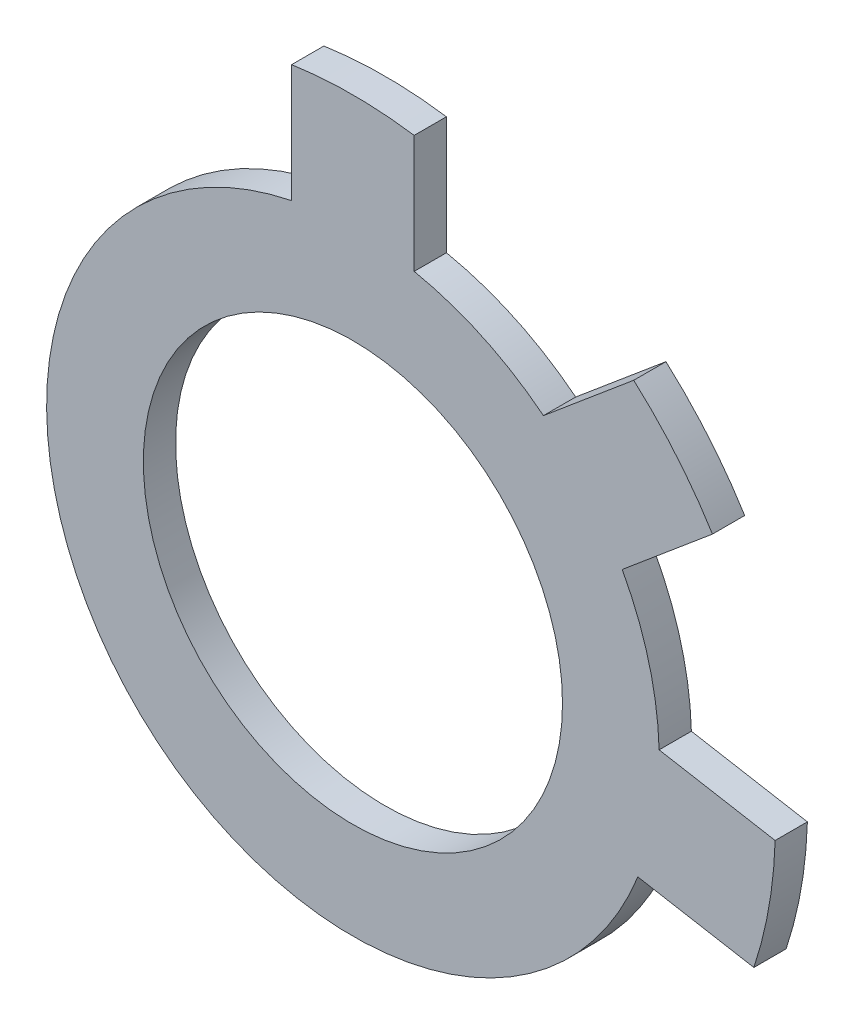
ISO-10303-21;
HEADER;
FILE_DESCRIPTION(('STEP AP214'),'2;1');
FILE_NAME('part.step','',(''),(''),'','','');
FILE_SCHEMA(('AUTOMOTIVE_DESIGN { 1 0 10303 214 1 1 1 1 }'));
ENDSEC;
DATA;
#1=APPLICATION_CONTEXT('core data for automotive mechanical design processes');
#2=APPLICATION_PROTOCOL_DEFINITION('international standard','automotive_design',2000,#1);
#3=PRODUCT_CONTEXT('',#1,'mechanical');
#4=PRODUCT('Part','Part','',(#3));
#5=PRODUCT_RELATED_PRODUCT_CATEGORY('part','',(#4));
#6=PRODUCT_DEFINITION_FORMATION('','',#4);
#7=PRODUCT_DEFINITION_CONTEXT('part definition',#1,'design');
#8=PRODUCT_DEFINITION('design','',#6,#7);
#9=PRODUCT_DEFINITION_SHAPE('','',#8);
#10=(LENGTH_UNIT() NAMED_UNIT(*) SI_UNIT(.MILLI.,.METRE.));
#11=(NAMED_UNIT(*) PLANE_ANGLE_UNIT() SI_UNIT($,.RADIAN.));
#12=(NAMED_UNIT(*) SI_UNIT($,.STERADIAN.) SOLID_ANGLE_UNIT());
#13=UNCERTAINTY_MEASURE_WITH_UNIT(LENGTH_MEASURE(1.E-05),#10,'distance_accuracy_value','');
#14=(GEOMETRIC_REPRESENTATION_CONTEXT(3) GLOBAL_UNCERTAINTY_ASSIGNED_CONTEXT((#13)) GLOBAL_UNIT_ASSIGNED_CONTEXT((#10,
#11,#12)) REPRESENTATION_CONTEXT('',''));
#15=CARTESIAN_POINT('',(0.,0.,0.));
#16=DIRECTION('',(0.,0.,1.));
#17=DIRECTION('',(1.,0.,0.));
#18=AXIS2_PLACEMENT_3D('',#15,#16,#17);
#19=CARTESIAN_POINT('',(0.,0.,1.));
#20=DIRECTION('',(0.,0.,1.));
#21=DIRECTION('',(1.,0.,0.));
#22=AXIS2_PLACEMENT_3D('',#19,#20,#21);
#23=PLANE('',#22);
#24=CARTESIAN_POINT('',(0.,0.,1.));
#25=DIRECTION('',(0.,0.,1.));
#26=DIRECTION('',(1.,0.,0.));
#27=AXIS2_PLACEMENT_3D('',#24,#25,#26);
#28=CIRCLE('',#27,13.1);
#29=CARTESIAN_POINT('',(1.9,12.9614813968157,1.));
#30=VERTEX_POINT('',#29);
#31=CARTESIAN_POINT('',(-1.9,12.9614813968157,1.));
#32=VERTEX_POINT('',#31);
#33=EDGE_CURVE('E176',#30,#32,#28,.T.);
#34=ORIENTED_EDGE('',*,*,#33,.T.);
#35=DIRECTION('',(0.,-1.,0.));
#36=VECTOR('',#35,1.);
#37=CARTESIAN_POINT('',(-1.9,9.30806102257608,1.));
#38=LINE('',#37,#36);
#39=CARTESIAN_POINT('',(-1.9,9.30806102257608,1.));
#40=VERTEX_POINT('',#39);
#41=EDGE_CURVE('E104',#32,#40,#38,.T.);
#42=ORIENTED_EDGE('',*,*,#41,.T.);
#43=CARTESIAN_POINT('',(0.,0.,1.));
#44=DIRECTION('',(0.,0.,1.));
#45=DIRECTION('',(1.,0.,0.));
#46=AXIS2_PLACEMENT_3D('',#43,#44,#45);
#47=CIRCLE('',#46,9.5);
#48=CARTESIAN_POINT('',(8.83671912297648,-3.48746256490615,1.));
#49=VERTEX_POINT('',#48);
#50=EDGE_CURVE('E203',#40,#49,#47,.T.);
#51=ORIENTED_EDGE('',*,*,#50,.T.);
#52=DIRECTION('',(0.984807753012207,-0.173648177666934,0.));
#53=VECTOR('',#52,1.);
#54=CARTESIAN_POINT('',(8.83671912297648,-3.48746256490615,1.));
#55=LINE('',#54,#53);
#56=CARTESIAN_POINT('',(12.4346358325404,-4.12187235514411,1.));
#57=VERTEX_POINT('',#56);
#58=EDGE_CURVE('E222',#49,#57,#55,.T.);
#59=ORIENTED_EDGE('',*,*,#58,.T.);
#60=CARTESIAN_POINT('',(0.,0.,1.));
#61=DIRECTION('',(0.,0.,1.));
#62=DIRECTION('',(1.,0.,0.));
#63=AXIS2_PLACEMENT_3D('',#60,#61,#62);
#64=CIRCLE('',#63,13.1);
#65=CARTESIAN_POINT('',(13.0944989076748,-0.37960289369773,1.));
#66=VERTEX_POINT('',#65);
#67=EDGE_CURVE('E219',#57,#66,#64,.T.);
#68=ORIENTED_EDGE('',*,*,#67,.T.);
#69=DIRECTION('',(-0.984807753012207,0.173648177666934,0.));
#70=VECTOR('',#69,1.);
#71=CARTESIAN_POINT('',(9.49658219811083,0.25480689654024,1.));
#72=LINE('',#71,#70);
#73=CARTESIAN_POINT('',(9.49658219811083,0.25480689654024,1.));
#74=VERTEX_POINT('',#73);
#75=EDGE_CURVE('E221',#66,#74,#72,.T.);
#76=ORIENTED_EDGE('',*,*,#75,.T.);
#77=CARTESIAN_POINT('',(0.,0.,1.));
#78=DIRECTION('',(0.,0.,1.));
#79=DIRECTION('',(1.,0.,0.));
#80=AXIS2_PLACEMENT_3D('',#77,#78,#79);
#81=CIRCLE('',#80,9.5);
#82=CARTESIAN_POINT('',(8.35168488096119,4.52762185359205,1.));
#83=VERTEX_POINT('',#82);
#84=EDGE_CURVE('E224',#74,#83,#81,.T.);
#85=ORIENTED_EDGE('',*,*,#84,.T.);
#86=DIRECTION('',(0.76604444311898,0.642787609686538,0.));
#87=VECTOR('',#86,1.);
#88=CARTESIAN_POINT('',(8.35168488096119,4.52762185359205,1.));
#89=LINE('',#88,#87);
#90=CARTESIAN_POINT('',(11.1503672570251,6.87599520312964,1.));
#91=VERTEX_POINT('',#90);
#92=EDGE_CURVE('E230',#83,#91,#89,.T.);
#93=ORIENTED_EDGE('',*,*,#92,.T.);
#94=CARTESIAN_POINT('',(0.,0.,1.));
#95=DIRECTION('',(0.,0.,1.));
#96=DIRECTION('',(1.,0.,0.));
#97=AXIS2_PLACEMENT_3D('',#94,#95,#96);
#98=CIRCLE('',#97,13.1);
#99=CARTESIAN_POINT('',(8.70777434021629,9.78696408698177,1.));
#100=VERTEX_POINT('',#99);
#101=EDGE_CURVE('E135',#91,#100,#98,.T.);
#102=ORIENTED_EDGE('',*,*,#101,.T.);
#103=DIRECTION('',(-0.76604444311898,-0.642787609686537,0.));
#104=VECTOR('',#103,1.);
#105=CARTESIAN_POINT('',(5.90909196415234,7.43859073744417,1.));
#106=LINE('',#105,#104);
#107=CARTESIAN_POINT('',(5.90909196415234,7.43859073744417,1.));
#108=VERTEX_POINT('',#107);
#109=EDGE_CURVE('E129',#100,#108,#106,.T.);
#110=ORIENTED_EDGE('',*,*,#109,.T.);
#111=CARTESIAN_POINT('',(0.,0.,1.));
#112=DIRECTION('',(0.,0.,1.));
#113=DIRECTION('',(1.,0.,0.));
#114=AXIS2_PLACEMENT_3D('',#111,#112,#113);
#115=CIRCLE('',#114,9.5);
#116=CARTESIAN_POINT('',(1.9,9.30806102257608,1.));
#117=VERTEX_POINT('',#116);
#118=EDGE_CURVE('E133',#108,#117,#115,.T.);
#119=ORIENTED_EDGE('',*,*,#118,.T.);
#120=DIRECTION('',(0.,1.,0.));
#121=VECTOR('',#120,1.);
#122=CARTESIAN_POINT('',(1.9,9.30806102257608,1.));
#123=LINE('',#122,#121);
#124=EDGE_CURVE('E49',#117,#30,#123,.T.);
#125=ORIENTED_EDGE('',*,*,#124,.T.);
#126=EDGE_LOOP('',(#34,#42,#51,#59,#68,#76,#85,#93,#102,#110,#119,#125));
#127=FACE_BOUND('',#126,.T.);
#128=CARTESIAN_POINT('',(0.,0.,1.));
#129=DIRECTION('',(0.,0.,1.));
#130=DIRECTION('',(1.,0.,0.));
#131=AXIS2_PLACEMENT_3D('',#128,#129,#130);
#132=CIRCLE('',#131,6.5);
#133=CARTESIAN_POINT('',(6.5,0.,1.));
#134=VERTEX_POINT('',#133);
#135=EDGE_CURVE('E157',#134,#134,#132,.T.);
#136=ORIENTED_EDGE('',*,*,#135,.F.);
#137=EDGE_LOOP('',(#136));
#138=FACE_BOUND('',#137,.T.);
#139=ADVANCED_FACE('F32',(#127,#138),#23,.T.);
#140=CARTESIAN_POINT('',(0.,0.,0.));
#141=DIRECTION('',(0.,0.,1.));
#142=DIRECTION('',(1.,0.,0.));
#143=AXIS2_PLACEMENT_3D('',#140,#141,#142);
#144=PLANE('',#143);
#145=CARTESIAN_POINT('',(0.,0.,0.));
#146=DIRECTION('',(0.,0.,1.));
#147=DIRECTION('',(1.,0.,0.));
#148=AXIS2_PLACEMENT_3D('',#145,#146,#147);
#149=CIRCLE('',#148,13.1);
#150=CARTESIAN_POINT('',(1.9,12.9614813968157,0.));
#151=VERTEX_POINT('',#150);
#152=CARTESIAN_POINT('',(-1.9,12.9614813968157,0.));
#153=VERTEX_POINT('',#152);
#154=EDGE_CURVE('E153',#151,#153,#149,.T.);
#155=ORIENTED_EDGE('',*,*,#154,.F.);
#156=DIRECTION('',(0.,1.,0.));
#157=VECTOR('',#156,1.);
#158=CARTESIAN_POINT('',(1.9,9.30806102257608,0.));
#159=LINE('',#158,#157);
#160=CARTESIAN_POINT('',(1.9,9.30806102257608,0.));
#161=VERTEX_POINT('',#160);
#162=EDGE_CURVE('E96',#161,#151,#159,.T.);
#163=ORIENTED_EDGE('',*,*,#162,.F.);
#164=CARTESIAN_POINT('',(0.,0.,0.));
#165=DIRECTION('',(0.,0.,1.));
#166=DIRECTION('',(1.,0.,0.));
#167=AXIS2_PLACEMENT_3D('',#164,#165,#166);
#168=CIRCLE('',#167,9.5);
#169=CARTESIAN_POINT('',(5.90909196415234,7.43859073744417,0.));
#170=VERTEX_POINT('',#169);
#171=EDGE_CURVE('E90',#170,#161,#168,.T.);
#172=ORIENTED_EDGE('',*,*,#171,.F.);
#173=DIRECTION('',(-0.76604444311898,-0.642787609686537,0.));
#174=VECTOR('',#173,1.);
#175=CARTESIAN_POINT('',(5.90909196415234,7.43859073744417,0.));
#176=LINE('',#175,#174);
#177=CARTESIAN_POINT('',(8.70777434021629,9.78696408698177,0.));
#178=VERTEX_POINT('',#177);
#179=EDGE_CURVE('E143',#178,#170,#176,.T.);
#180=ORIENTED_EDGE('',*,*,#179,.F.);
#181=CARTESIAN_POINT('',(0.,0.,0.));
#182=DIRECTION('',(0.,0.,1.));
#183=DIRECTION('',(1.,0.,0.));
#184=AXIS2_PLACEMENT_3D('',#181,#182,#183);
#185=CIRCLE('',#184,13.1);
#186=CARTESIAN_POINT('',(11.1503672570251,6.87599520312964,0.));
#187=VERTEX_POINT('',#186);
#188=EDGE_CURVE('E171',#187,#178,#185,.T.);
#189=ORIENTED_EDGE('',*,*,#188,.F.);
#190=DIRECTION('',(0.76604444311898,0.642787609686538,0.));
#191=VECTOR('',#190,1.);
#192=CARTESIAN_POINT('',(8.35168488096119,4.52762185359205,0.));
#193=LINE('',#192,#191);
#194=CARTESIAN_POINT('',(8.35168488096119,4.52762185359205,0.));
#195=VERTEX_POINT('',#194);
#196=EDGE_CURVE('E169',#195,#187,#193,.T.);
#197=ORIENTED_EDGE('',*,*,#196,.F.);
#198=CARTESIAN_POINT('',(0.,0.,0.));
#199=DIRECTION('',(0.,0.,1.));
#200=DIRECTION('',(1.,0.,0.));
#201=AXIS2_PLACEMENT_3D('',#198,#199,#200);
#202=CIRCLE('',#201,9.5);
#203=CARTESIAN_POINT('',(9.49658219811083,0.25480689654024,0.));
#204=VERTEX_POINT('',#203);
#205=EDGE_CURVE('E167',#204,#195,#202,.T.);
#206=ORIENTED_EDGE('',*,*,#205,.F.);
#207=DIRECTION('',(-0.984807753012207,0.173648177666934,0.));
#208=VECTOR('',#207,1.);
#209=CARTESIAN_POINT('',(9.49658219811083,0.25480689654024,0.));
#210=LINE('',#209,#208);
#211=CARTESIAN_POINT('',(13.0944989076748,-0.37960289369773,0.));
#212=VERTEX_POINT('',#211);
#213=EDGE_CURVE('E165',#212,#204,#210,.T.);
#214=ORIENTED_EDGE('',*,*,#213,.F.);
#215=CARTESIAN_POINT('',(0.,0.,0.));
#216=DIRECTION('',(0.,0.,1.));
#217=DIRECTION('',(1.,0.,0.));
#218=AXIS2_PLACEMENT_3D('',#215,#216,#217);
#219=CIRCLE('',#218,13.1);
#220=CARTESIAN_POINT('',(12.4346358325404,-4.12187235514411,0.));
#221=VERTEX_POINT('',#220);
#222=EDGE_CURVE('E163',#221,#212,#219,.T.);
#223=ORIENTED_EDGE('',*,*,#222,.F.);
#224=DIRECTION('',(0.984807753012207,-0.173648177666934,0.));
#225=VECTOR('',#224,1.);
#226=CARTESIAN_POINT('',(8.83671912297648,-3.48746256490615,0.));
#227=LINE('',#226,#225);
#228=CARTESIAN_POINT('',(8.83671912297648,-3.48746256490615,0.));
#229=VERTEX_POINT('',#228);
#230=EDGE_CURVE('E161',#229,#221,#227,.T.);
#231=ORIENTED_EDGE('',*,*,#230,.F.);
#232=CARTESIAN_POINT('',(0.,0.,0.));
#233=DIRECTION('',(0.,0.,1.));
#234=DIRECTION('',(1.,0.,0.));
#235=AXIS2_PLACEMENT_3D('',#232,#233,#234);
#236=CIRCLE('',#235,9.5);
#237=CARTESIAN_POINT('',(-1.9,9.30806102257608,0.));
#238=VERTEX_POINT('',#237);
#239=EDGE_CURVE('E159',#238,#229,#236,.T.);
#240=ORIENTED_EDGE('',*,*,#239,.F.);
#241=DIRECTION('',(0.,-1.,0.));
#242=VECTOR('',#241,1.);
#243=CARTESIAN_POINT('',(-1.9,9.30806102257608,0.));
#244=LINE('',#243,#242);
#245=EDGE_CURVE('E156',#153,#238,#244,.T.);
#246=ORIENTED_EDGE('',*,*,#245,.F.);
#247=EDGE_LOOP('',(#155,#163,#172,#180,#189,#197,#206,#214,#223,#231,#240,#246));
#248=FACE_BOUND('',#247,.T.);
#249=CARTESIAN_POINT('',(0.,0.,0.));
#250=DIRECTION('',(0.,0.,1.));
#251=DIRECTION('',(1.,0.,0.));
#252=AXIS2_PLACEMENT_3D('',#249,#250,#251);
#253=CIRCLE('',#252,6.5);
#254=CARTESIAN_POINT('',(6.5,0.,0.));
#255=VERTEX_POINT('',#254);
#256=EDGE_CURVE('E377',#255,#255,#253,.T.);
#257=ORIENTED_EDGE('',*,*,#256,.T.);
#258=EDGE_LOOP('',(#257));
#259=FACE_BOUND('',#258,.T.);
#260=ADVANCED_FACE('F207',(#248,#259),#144,.F.);
#261=CARTESIAN_POINT('',(0.,0.,1.));
#262=DIRECTION('',(0.,0.,-1.));
#263=DIRECTION('',(-1.,0.,0.));
#264=AXIS2_PLACEMENT_3D('',#261,#262,#263);
#265=CYLINDRICAL_SURFACE('',#264,13.1);
#266=ORIENTED_EDGE('',*,*,#154,.T.);
#267=DIRECTION('',(0.,0.,-1.));
#268=VECTOR('',#267,1.);
#269=CARTESIAN_POINT('',(-1.9,12.9614813968157,1.));
#270=LINE('',#269,#268);
#271=EDGE_CURVE('E11',#32,#153,#270,.T.);
#272=ORIENTED_EDGE('',*,*,#271,.F.);
#273=ORIENTED_EDGE('',*,*,#33,.F.);
#274=DIRECTION('',(0.,0.,-1.));
#275=VECTOR('',#274,1.);
#276=CARTESIAN_POINT('',(1.9,12.9614813968157,1.));
#277=LINE('',#276,#275);
#278=EDGE_CURVE('E149',#30,#151,#277,.T.);
#279=ORIENTED_EDGE('',*,*,#278,.T.);
#280=EDGE_LOOP('',(#266,#272,#273,#279));
#281=FACE_BOUND('',#280,.T.);
#282=ADVANCED_FACE('F34',(#281),#265,.T.);
#283=CARTESIAN_POINT('',(-1.9,9.30806102257608,1.));
#284=DIRECTION('',(1.,0.,0.));
#285=DIRECTION('',(0.,0.,-1.));
#286=AXIS2_PLACEMENT_3D('',#283,#284,#285);
#287=PLANE('',#286);
#288=ORIENTED_EDGE('',*,*,#245,.T.);
#289=DIRECTION('',(0.,0.,-1.));
#290=VECTOR('',#289,1.);
#291=CARTESIAN_POINT('',(-1.9,9.30806102257608,1.));
#292=LINE('',#291,#290);
#293=EDGE_CURVE('E41',#40,#238,#292,.T.);
#294=ORIENTED_EDGE('',*,*,#293,.F.);
#295=ORIENTED_EDGE('',*,*,#41,.F.);
#296=ORIENTED_EDGE('',*,*,#271,.T.);
#297=EDGE_LOOP('',(#288,#294,#295,#296));
#298=FACE_BOUND('',#297,.T.);
#299=ADVANCED_FACE('F264',(#298),#287,.F.);
#300=CARTESIAN_POINT('',(0.,0.,1.));
#301=DIRECTION('',(0.,0.,-1.));
#302=DIRECTION('',(-1.,0.,0.));
#303=AXIS2_PLACEMENT_3D('',#300,#301,#302);
#304=CYLINDRICAL_SURFACE('',#303,9.5);
#305=ORIENTED_EDGE('',*,*,#239,.T.);
#306=DIRECTION('',(0.,0.,-1.));
#307=VECTOR('',#306,1.);
#308=CARTESIAN_POINT('',(8.83671912297648,-3.48746256490615,1.));
#309=LINE('',#308,#307);
#310=EDGE_CURVE('E195',#49,#229,#309,.T.);
#311=ORIENTED_EDGE('',*,*,#310,.F.);
#312=ORIENTED_EDGE('',*,*,#50,.F.);
#313=ORIENTED_EDGE('',*,*,#293,.T.);
#314=EDGE_LOOP('',(#305,#311,#312,#313));
#315=FACE_BOUND('',#314,.T.);
#316=ADVANCED_FACE('F201',(#315),#304,.T.);
#317=CARTESIAN_POINT('',(8.83671912297648,-3.48746256490615,1.));
#318=DIRECTION('',(0.173648177666934,0.984807753012207,0.));
#319=DIRECTION('',(-0.984807753012208,0.173648177666934,0.));
#320=AXIS2_PLACEMENT_3D('',#317,#318,#319);
#321=PLANE('',#320);
#322=ORIENTED_EDGE('',*,*,#230,.T.);
#323=DIRECTION('',(0.,0.,-1.));
#324=VECTOR('',#323,1.);
#325=CARTESIAN_POINT('',(12.4346358325404,-4.12187235514411,1.));
#326=LINE('',#325,#324);
#327=EDGE_CURVE('E192',#57,#221,#326,.T.);
#328=ORIENTED_EDGE('',*,*,#327,.F.);
#329=ORIENTED_EDGE('',*,*,#58,.F.);
#330=ORIENTED_EDGE('',*,*,#310,.T.);
#331=EDGE_LOOP('',(#322,#328,#329,#330));
#332=FACE_BOUND('',#331,.T.);
#333=ADVANCED_FACE('F213',(#332),#321,.F.);
#334=CARTESIAN_POINT('',(0.,0.,1.));
#335=DIRECTION('',(0.,0.,-1.));
#336=DIRECTION('',(-1.,0.,0.));
#337=AXIS2_PLACEMENT_3D('',#334,#335,#336);
#338=CYLINDRICAL_SURFACE('',#337,13.1);
#339=ORIENTED_EDGE('',*,*,#222,.T.);
#340=DIRECTION('',(0.,0.,-1.));
#341=VECTOR('',#340,1.);
#342=CARTESIAN_POINT('',(13.0944989076748,-0.37960289369773,1.));
#343=LINE('',#342,#341);
#344=EDGE_CURVE('E189',#66,#212,#343,.T.);
#345=ORIENTED_EDGE('',*,*,#344,.F.);
#346=ORIENTED_EDGE('',*,*,#67,.F.);
#347=ORIENTED_EDGE('',*,*,#327,.T.);
#348=EDGE_LOOP('',(#339,#345,#346,#347));
#349=FACE_BOUND('',#348,.T.);
#350=ADVANCED_FACE('F217',(#349),#338,.T.);
#351=CARTESIAN_POINT('',(9.49658219811083,0.25480689654024,1.));
#352=DIRECTION('',(-0.173648177666934,-0.984807753012207,0.));
#353=DIRECTION('',(0.984807753012208,-0.173648177666934,0.));
#354=AXIS2_PLACEMENT_3D('',#351,#352,#353);
#355=PLANE('',#354);
#356=ORIENTED_EDGE('',*,*,#213,.T.);
#357=DIRECTION('',(0.,0.,-1.));
#358=VECTOR('',#357,1.);
#359=CARTESIAN_POINT('',(9.49658219811083,0.25480689654024,1.));
#360=LINE('',#359,#358);
#361=EDGE_CURVE('E186',#74,#204,#360,.T.);
#362=ORIENTED_EDGE('',*,*,#361,.F.);
#363=ORIENTED_EDGE('',*,*,#75,.F.);
#364=ORIENTED_EDGE('',*,*,#344,.T.);
#365=EDGE_LOOP('',(#356,#362,#363,#364));
#366=FACE_BOUND('',#365,.T.);
#367=ADVANCED_FACE('F277',(#366),#355,.F.);
#368=CARTESIAN_POINT('',(0.,0.,1.));
#369=DIRECTION('',(0.,0.,-1.));
#370=DIRECTION('',(-1.,0.,0.));
#371=AXIS2_PLACEMENT_3D('',#368,#369,#370);
#372=CYLINDRICAL_SURFACE('',#371,9.5);
#373=ORIENTED_EDGE('',*,*,#205,.T.);
#374=DIRECTION('',(0.,0.,-1.));
#375=VECTOR('',#374,1.);
#376=CARTESIAN_POINT('',(8.35168488096119,4.52762185359205,1.));
#377=LINE('',#376,#375);
#378=EDGE_CURVE('E183',#83,#195,#377,.T.);
#379=ORIENTED_EDGE('',*,*,#378,.F.);
#380=ORIENTED_EDGE('',*,*,#84,.F.);
#381=ORIENTED_EDGE('',*,*,#361,.T.);
#382=EDGE_LOOP('',(#373,#379,#380,#381));
#383=FACE_BOUND('',#382,.T.);
#384=ADVANCED_FACE('F280',(#383),#372,.T.);
#385=CARTESIAN_POINT('',(8.35168488096119,4.52762185359205,1.));
#386=DIRECTION('',(-0.642787609686538,0.76604444311898,0.));
#387=DIRECTION('',(-0.76604444311898,-0.642787609686538,0.));
#388=AXIS2_PLACEMENT_3D('',#385,#386,#387);
#389=PLANE('',#388);
#390=ORIENTED_EDGE('',*,*,#196,.T.);
#391=DIRECTION('',(0.,0.,-1.));
#392=VECTOR('',#391,1.);
#393=CARTESIAN_POINT('',(11.1503672570251,6.87599520312964,1.));
#394=LINE('',#393,#392);
#395=EDGE_CURVE('E180',#91,#187,#394,.T.);
#396=ORIENTED_EDGE('',*,*,#395,.F.);
#397=ORIENTED_EDGE('',*,*,#92,.F.);
#398=ORIENTED_EDGE('',*,*,#378,.T.);
#399=EDGE_LOOP('',(#390,#396,#397,#398));
#400=FACE_BOUND('',#399,.T.);
#401=ADVANCED_FACE('F236',(#400),#389,.F.);
#402=CARTESIAN_POINT('',(0.,0.,1.));
#403=DIRECTION('',(0.,0.,-1.));
#404=DIRECTION('',(-1.,0.,0.));
#405=AXIS2_PLACEMENT_3D('',#402,#403,#404);
#406=CYLINDRICAL_SURFACE('',#405,13.1);
#407=ORIENTED_EDGE('',*,*,#188,.T.);
#408=DIRECTION('',(0.,0.,-1.));
#409=VECTOR('',#408,1.);
#410=CARTESIAN_POINT('',(8.70777434021629,9.78696408698177,1.));
#411=LINE('',#410,#409);
#412=EDGE_CURVE('E144',#100,#178,#411,.T.);
#413=ORIENTED_EDGE('',*,*,#412,.F.);
#414=ORIENTED_EDGE('',*,*,#101,.F.);
#415=ORIENTED_EDGE('',*,*,#395,.T.);
#416=EDGE_LOOP('',(#407,#413,#414,#415));
#417=FACE_BOUND('',#416,.T.);
#418=ADVANCED_FACE('F240',(#417),#406,.T.);
#419=CARTESIAN_POINT('',(5.90909196415234,7.43859073744417,1.));
#420=DIRECTION('',(0.642787609686537,-0.76604444311898,0.));
#421=DIRECTION('',(0.76604444311898,0.642787609686537,0.));
#422=AXIS2_PLACEMENT_3D('',#419,#420,#421);
#423=PLANE('',#422);
#424=ORIENTED_EDGE('',*,*,#179,.T.);
#425=DIRECTION('',(0.,0.,-1.));
#426=VECTOR('',#425,1.);
#427=CARTESIAN_POINT('',(5.90909196415234,7.43859073744417,1.));
#428=LINE('',#427,#426);
#429=EDGE_CURVE('E140',#108,#170,#428,.T.);
#430=ORIENTED_EDGE('',*,*,#429,.F.);
#431=ORIENTED_EDGE('',*,*,#109,.F.);
#432=ORIENTED_EDGE('',*,*,#412,.T.);
#433=EDGE_LOOP('',(#424,#430,#431,#432));
#434=FACE_BOUND('',#433,.T.);
#435=ADVANCED_FACE('F141',(#434),#423,.F.);
#436=CARTESIAN_POINT('',(0.,0.,1.));
#437=DIRECTION('',(0.,0.,-1.));
#438=DIRECTION('',(-1.,0.,0.));
#439=AXIS2_PLACEMENT_3D('',#436,#437,#438);
#440=CYLINDRICAL_SURFACE('',#439,9.5);
#441=ORIENTED_EDGE('',*,*,#171,.T.);
#442=DIRECTION('',(0.,0.,-1.));
#443=VECTOR('',#442,1.);
#444=CARTESIAN_POINT('',(1.9,9.30806102257608,1.));
#445=LINE('',#444,#443);
#446=EDGE_CURVE('E145',#117,#161,#445,.T.);
#447=ORIENTED_EDGE('',*,*,#446,.F.);
#448=ORIENTED_EDGE('',*,*,#118,.F.);
#449=ORIENTED_EDGE('',*,*,#429,.T.);
#450=EDGE_LOOP('',(#441,#447,#448,#449));
#451=FACE_BOUND('',#450,.T.);
#452=ADVANCED_FACE('F147',(#451),#440,.T.);
#453=CARTESIAN_POINT('',(1.9,9.30806102257608,1.));
#454=DIRECTION('',(-1.,0.,0.));
#455=DIRECTION('',(0.,0.,1.));
#456=AXIS2_PLACEMENT_3D('',#453,#454,#455);
#457=PLANE('',#456);
#458=ORIENTED_EDGE('',*,*,#162,.T.);
#459=ORIENTED_EDGE('',*,*,#278,.F.);
#460=ORIENTED_EDGE('',*,*,#124,.F.);
#461=ORIENTED_EDGE('',*,*,#446,.T.);
#462=EDGE_LOOP('',(#458,#459,#460,#461));
#463=FACE_BOUND('',#462,.T.);
#464=ADVANCED_FACE('F244',(#463),#457,.F.);
#465=CARTESIAN_POINT('',(0.,0.,1.));
#466=DIRECTION('',(0.,0.,-1.));
#467=DIRECTION('',(-1.,0.,0.));
#468=AXIS2_PLACEMENT_3D('',#465,#466,#467);
#469=CYLINDRICAL_SURFACE('',#468,6.5);
#470=ORIENTED_EDGE('',*,*,#135,.T.);
#471=EDGE_LOOP('',(#470));
#472=FACE_BOUND('',#471,.T.);
#473=ORIENTED_EDGE('',*,*,#256,.F.);
#474=EDGE_LOOP('',(#473));
#475=FACE_BOUND('',#474,.T.);
#476=ADVANCED_FACE('F246',(#472,#475),#469,.F.);
#477=CLOSED_SHELL('',(#139,#260,#282,#299,#316,#333,#350,#367,#384,#401,#418,#435,#452,#464,#476));
#478=MANIFOLD_SOLID_BREP('B2',#477);
#479=ADVANCED_BREP_SHAPE_REPRESENTATION('',(#18,#478),#14);
#480=SHAPE_DEFINITION_REPRESENTATION(#9,#479);
ENDSEC;
END-ISO-10303-21;
